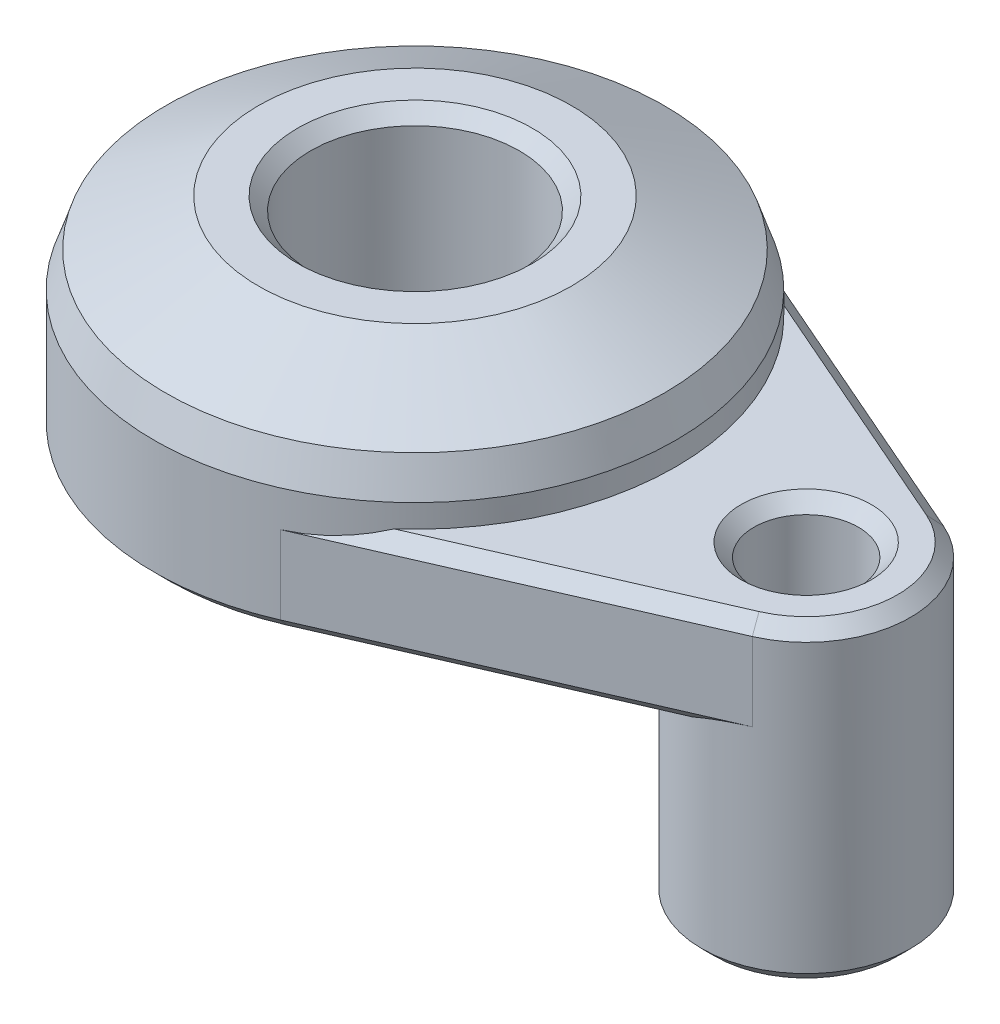
ISO-10303-21;
HEADER;
FILE_DESCRIPTION(('STEP AP214'),'2;1');
FILE_NAME('part.step','',(''),(''),'','','');
FILE_SCHEMA(('AUTOMOTIVE_DESIGN { 1 0 10303 214 1 1 1 1 }'));
ENDSEC;
DATA;
#1=APPLICATION_CONTEXT('core data for automotive mechanical design processes');
#2=APPLICATION_PROTOCOL_DEFINITION('international standard','automotive_design',2000,#1);
#3=PRODUCT_CONTEXT('',#1,'mechanical');
#4=PRODUCT('Part','Part','',(#3));
#5=PRODUCT_RELATED_PRODUCT_CATEGORY('part','',(#4));
#6=PRODUCT_DEFINITION_FORMATION('','',#4);
#7=PRODUCT_DEFINITION_CONTEXT('part definition',#1,'design');
#8=PRODUCT_DEFINITION('design','',#6,#7);
#9=PRODUCT_DEFINITION_SHAPE('','',#8);
#10=(LENGTH_UNIT() NAMED_UNIT(*) SI_UNIT(.MILLI.,.METRE.));
#11=(NAMED_UNIT(*) PLANE_ANGLE_UNIT() SI_UNIT($,.RADIAN.));
#12=(NAMED_UNIT(*) SI_UNIT($,.STERADIAN.) SOLID_ANGLE_UNIT());
#13=UNCERTAINTY_MEASURE_WITH_UNIT(LENGTH_MEASURE(1.E-05),#10,'distance_accuracy_value','');
#14=(GEOMETRIC_REPRESENTATION_CONTEXT(3) GLOBAL_UNCERTAINTY_ASSIGNED_CONTEXT((#13)) GLOBAL_UNIT_ASSIGNED_CONTEXT((#10,
#11,#12)) REPRESENTATION_CONTEXT('',''));
#15=CARTESIAN_POINT('',(0.,0.,0.));
#16=DIRECTION('',(0.,0.,1.));
#17=DIRECTION('',(1.,0.,0.));
#18=AXIS2_PLACEMENT_3D('',#15,#16,#17);
#19=CARTESIAN_POINT('',(0.,2.,0.));
#20=DIRECTION('',(0.,-1.,0.));
#21=DIRECTION('',(0.,0.,-1.));
#22=AXIS2_PLACEMENT_3D('',#19,#20,#21);
#23=CYLINDRICAL_SURFACE('',#22,5.);
#24=CARTESIAN_POINT('',(0.,2.44098300562487,0.));
#25=DIRECTION('',(0.,1.,0.));
#26=DIRECTION('',(-1.,0.,0.));
#27=AXIS2_PLACEMENT_3D('',#24,#25,#26);
#28=CIRCLE('',#27,5.);
#29=CARTESIAN_POINT('',(5.,2.44098300562489,0.));
#30=VERTEX_POINT('',#29);
#31=EDGE_CURVE('E125',#30,#30,#28,.F.);
#32=ORIENTED_EDGE('',*,*,#31,.T.);
#33=EDGE_LOOP('',(#32));
#34=FACE_BOUND('',#33,.T.);
#35=CARTESIAN_POINT('',(0.,2.,0.));
#36=DIRECTION('',(0.,-1.,0.));
#37=DIRECTION('',(1.,0.,0.));
#38=AXIS2_PLACEMENT_3D('',#35,#36,#37);
#39=CIRCLE('',#38,5.00000000000001);
#40=CARTESIAN_POINT('',(3.33090880212542,2.00000000000001,-3.72894711036821));
#41=VERTEX_POINT('',#40);
#42=CARTESIAN_POINT('',(3.33090880212543,2.00000000000001,3.7289471103682));
#43=VERTEX_POINT('',#42);
#44=EDGE_CURVE('E126',#41,#43,#39,.T.);
#45=ORIENTED_EDGE('',*,*,#44,.F.);
#46=CARTESIAN_POINT('',(0.,6.75000000000002,0.));
#47=DIRECTION('',(0.282842712474619,0.707106781186546,-0.648074069840787));
#48=DIRECTION('',(0.282842712474618,-0.707106781186549,-0.648074069840785));
#49=AXIS2_PLACEMENT_3D('',#46,#47,#48);
#50=ELLIPSE('',#49,7.07106781186549,5.);
#51=CARTESIAN_POINT('',(2.,1.75,-4.58257569495584));
#52=VERTEX_POINT('',#51);
#53=EDGE_CURVE('E57',#41,#52,#50,.T.);
#54=ORIENTED_EDGE('',*,*,#53,.T.);
#55=DIRECTION('',(0.,-1.,0.));
#56=VECTOR('',#55,1.);
#57=CARTESIAN_POINT('',(2.,2.,-4.58257569495584));
#58=LINE('',#57,#56);
#59=CARTESIAN_POINT('',(2.,0.250000000000002,-4.58257569495584));
#60=VERTEX_POINT('',#59);
#61=EDGE_CURVE('E119',#52,#60,#58,.T.);
#62=ORIENTED_EDGE('',*,*,#61,.T.);
#63=CARTESIAN_POINT('',(0.,0.250000000000002,0.));
#64=DIRECTION('',(0.,1.,0.));
#65=DIRECTION('',(0.,0.,1.));
#66=AXIS2_PLACEMENT_3D('',#63,#64,#65);
#67=CIRCLE('',#66,5.);
#68=CARTESIAN_POINT('',(2.,0.250000000000002,4.58257569495584));
#69=VERTEX_POINT('',#68);
#70=EDGE_CURVE('E118',#60,#69,#67,.T.);
#71=ORIENTED_EDGE('',*,*,#70,.T.);
#72=DIRECTION('',(0.,-1.,0.));
#73=VECTOR('',#72,1.);
#74=CARTESIAN_POINT('',(2.,2.,4.58257569495584));
#75=LINE('',#74,#73);
#76=CARTESIAN_POINT('',(2.,1.75,4.58257569495584));
#77=VERTEX_POINT('',#76);
#78=EDGE_CURVE('E107',#77,#69,#75,.T.);
#79=ORIENTED_EDGE('',*,*,#78,.F.);
#80=CARTESIAN_POINT('',(0.,6.75,0.));
#81=DIRECTION('',(0.282842712474619,0.707106781186547,0.648074069840786));
#82=DIRECTION('',(0.282842712474619,-0.707106781186548,0.648074069840786));
#83=AXIS2_PLACEMENT_3D('',#80,#81,#82);
#84=ELLIPSE('',#83,7.07106781186547,5.);
#85=EDGE_CURVE('E185',#77,#43,#84,.T.);
#86=ORIENTED_EDGE('',*,*,#85,.T.);
#87=EDGE_LOOP('',(#45,#54,#62,#71,#79,#86));
#88=FACE_BOUND('',#87,.T.);
#89=ADVANCED_FACE('F41',(#34,#88),#23,.T.);
#90=CARTESIAN_POINT('',(2.,2.,4.58257569495584));
#91=DIRECTION('',(-0.4,0.,-0.916515138991168));
#92=DIRECTION('',(-0.916515138991168,0.,0.4));
#93=AXIS2_PLACEMENT_3D('',#90,#91,#92);
#94=PLANE('',#93);
#95=DIRECTION('',(0.,-1.,0.));
#96=VECTOR('',#95,1.);
#97=CARTESIAN_POINT('',(8.3,2.,1.83303027798234));
#98=LINE('',#97,#96);
#99=CARTESIAN_POINT('',(8.3,1.75,1.83303027798234));
#100=VERTEX_POINT('',#99);
#101=CARTESIAN_POINT('',(8.3,0.250000000000002,1.83303027798234));
#102=VERTEX_POINT('',#101);
#103=EDGE_CURVE('E115',#100,#102,#98,.T.);
#104=ORIENTED_EDGE('',*,*,#103,.F.);
#105=DIRECTION('',(-0.916515138991168,0.,0.4));
#106=VECTOR('',#105,1.);
#107=CARTESIAN_POINT('',(2.,1.75,4.58257569495584));
#108=LINE('',#107,#106);
#109=EDGE_CURVE('E65',#100,#77,#108,.T.);
#110=ORIENTED_EDGE('',*,*,#109,.T.);
#111=ORIENTED_EDGE('',*,*,#78,.T.);
#112=DIRECTION('',(0.916515138991168,0.,-0.4));
#113=VECTOR('',#112,1.);
#114=CARTESIAN_POINT('',(2.,0.250000000000002,4.58257569495584));
#115=LINE('',#114,#113);
#116=EDGE_CURVE('E111',#69,#102,#115,.T.);
#117=ORIENTED_EDGE('',*,*,#116,.T.);
#118=EDGE_LOOP('',(#104,#110,#111,#117));
#119=FACE_BOUND('',#118,.T.);
#120=ADVANCED_FACE('F109',(#119),#94,.F.);
#121=CARTESIAN_POINT('',(7.5,2.,0.));
#122=DIRECTION('',(0.,-1.,0.));
#123=DIRECTION('',(0.,0.,-1.));
#124=AXIS2_PLACEMENT_3D('',#121,#122,#123);
#125=CYLINDRICAL_SURFACE('',#124,2.);
#126=CARTESIAN_POINT('',(7.5,-3.75,0.));
#127=DIRECTION('',(0.,1.,0.));
#128=DIRECTION('',(0.,0.,1.));
#129=AXIS2_PLACEMENT_3D('',#126,#127,#128);
#130=CIRCLE('',#129,2.);
#131=CARTESIAN_POINT('',(7.5,-3.75,2.));
#132=VERTEX_POINT('',#131);
#133=EDGE_CURVE('E163',#132,#132,#130,.T.);
#134=ORIENTED_EDGE('',*,*,#133,.T.);
#135=EDGE_LOOP('',(#134));
#136=FACE_BOUND('',#135,.T.);
#137=DIRECTION('',(0.,-1.,0.));
#138=VECTOR('',#137,1.);
#139=CARTESIAN_POINT('',(8.3,2.,-1.83303027798234));
#140=LINE('',#139,#138);
#141=CARTESIAN_POINT('',(8.3,1.75,-1.83303027798234));
#142=VERTEX_POINT('',#141);
#143=CARTESIAN_POINT('',(8.3,0.250000000000002,-1.83303027798234));
#144=VERTEX_POINT('',#143);
#145=EDGE_CURVE('E248',#142,#144,#140,.T.);
#146=ORIENTED_EDGE('',*,*,#145,.F.);
#147=CARTESIAN_POINT('',(7.5,1.75,0.));
#148=DIRECTION('',(0.,1.,0.));
#149=DIRECTION('',(0.,0.,1.));
#150=AXIS2_PLACEMENT_3D('',#147,#148,#149);
#151=CIRCLE('',#150,2.);
#152=EDGE_CURVE('E161',#142,#100,#151,.F.);
#153=ORIENTED_EDGE('',*,*,#152,.T.);
#154=ORIENTED_EDGE('',*,*,#103,.T.);
#155=CARTESIAN_POINT('',(7.5,-1.74999999999999,0.));
#156=DIRECTION('',(-0.282842712474619,0.707106781186548,-0.648074069840785));
#157=DIRECTION('',(-0.282842712474619,-0.707106781186547,-0.648074069840787));
#158=AXIS2_PLACEMENT_3D('',#155,#156,#157);
#159=ELLIPSE('',#158,2.82842712474619,2.);
#160=CARTESIAN_POINT('',(7.31258803253505,0.,1.99119982785529));
#161=VERTEX_POINT('',#160);
#162=EDGE_CURVE('E134',#102,#161,#159,.F.);
#163=ORIENTED_EDGE('',*,*,#162,.T.);
#164=CARTESIAN_POINT('',(7.5,0.,0.));
#165=DIRECTION('',(0.,1.,0.));
#166=DIRECTION('',(0.,0.,1.));
#167=AXIS2_PLACEMENT_3D('',#164,#165,#166);
#168=CIRCLE('',#167,2.);
#169=CARTESIAN_POINT('',(7.31258803253505,0.,-1.99119982785529));
#170=VERTEX_POINT('',#169);
#171=EDGE_CURVE('E114',#170,#161,#168,.T.);
#172=ORIENTED_EDGE('',*,*,#171,.F.);
#173=CARTESIAN_POINT('',(7.5,-1.75,0.));
#174=DIRECTION('',(-0.282842712474619,0.707106781186548,0.648074069840786));
#175=DIRECTION('',(-0.282842712474619,-0.707106781186547,0.648074069840787));
#176=AXIS2_PLACEMENT_3D('',#173,#174,#175);
#177=ELLIPSE('',#176,2.82842712474619,2.);
#178=EDGE_CURVE('E135',#170,#144,#177,.F.);
#179=ORIENTED_EDGE('',*,*,#178,.T.);
#180=EDGE_LOOP('',(#146,#153,#154,#163,#172,#179));
#181=FACE_BOUND('',#180,.T.);
#182=ADVANCED_FACE('F266',(#136,#181),#125,.T.);
#183=CARTESIAN_POINT('',(8.3,2.,-1.83303027798234));
#184=DIRECTION('',(-0.4,0.,0.916515138991168));
#185=DIRECTION('',(0.916515138991168,0.,0.4));
#186=AXIS2_PLACEMENT_3D('',#183,#184,#185);
#187=PLANE('',#186);
#188=ORIENTED_EDGE('',*,*,#61,.F.);
#189=DIRECTION('',(0.916515138991168,0.,0.4));
#190=VECTOR('',#189,1.);
#191=CARTESIAN_POINT('',(8.3,1.75,-1.83303027798234));
#192=LINE('',#191,#190);
#193=EDGE_CURVE('E177',#52,#142,#192,.T.);
#194=ORIENTED_EDGE('',*,*,#193,.T.);
#195=ORIENTED_EDGE('',*,*,#145,.T.);
#196=DIRECTION('',(-0.916515138991168,0.,-0.4));
#197=VECTOR('',#196,1.);
#198=CARTESIAN_POINT('',(8.3,0.250000000000002,-1.83303027798234));
#199=LINE('',#198,#197);
#200=EDGE_CURVE('E256',#144,#60,#199,.T.);
#201=ORIENTED_EDGE('',*,*,#200,.T.);
#202=EDGE_LOOP('',(#188,#194,#195,#201));
#203=FACE_BOUND('',#202,.T.);
#204=ADVANCED_FACE('F289',(#203),#187,.F.);
#205=CARTESIAN_POINT('',(0.,2.,0.));
#206=DIRECTION('',(0.,1.,0.));
#207=DIRECTION('',(0.,0.,1.));
#208=AXIS2_PLACEMENT_3D('',#205,#206,#207);
#209=PLANE('',#208);
#210=CARTESIAN_POINT('',(7.5,2.,0.));
#211=DIRECTION('',(0.,1.,0.));
#212=DIRECTION('',(0.,0.,1.));
#213=AXIS2_PLACEMENT_3D('',#210,#211,#212);
#214=CIRCLE('',#213,1.25000000000001);
#215=CARTESIAN_POINT('',(7.5,2.,1.25000000000001));
#216=VERTEX_POINT('',#215);
#217=EDGE_CURVE('E173',#216,#216,#214,.F.);
#218=ORIENTED_EDGE('',*,*,#217,.T.);
#219=EDGE_LOOP('',(#218));
#220=FACE_BOUND('',#219,.T.);
#221=ORIENTED_EDGE('',*,*,#44,.T.);
#222=DIRECTION('',(0.916515138991168,0.,-0.4));
#223=VECTOR('',#222,1.);
#224=CARTESIAN_POINT('',(8.2,2.,1.60390149323454));
#225=LINE('',#224,#223);
#226=CARTESIAN_POINT('',(8.2,2.,1.60390149323454));
#227=VERTEX_POINT('',#226);
#228=EDGE_CURVE('E170',#43,#227,#225,.T.);
#229=ORIENTED_EDGE('',*,*,#228,.T.);
#230=CARTESIAN_POINT('',(7.5,2.,0.));
#231=DIRECTION('',(0.,1.,0.));
#232=DIRECTION('',(0.,0.,1.));
#233=AXIS2_PLACEMENT_3D('',#230,#231,#232);
#234=CIRCLE('',#233,1.75);
#235=CARTESIAN_POINT('',(8.2,2.,-1.60390149323455));
#236=VERTEX_POINT('',#235);
#237=EDGE_CURVE('E166',#227,#236,#234,.T.);
#238=ORIENTED_EDGE('',*,*,#237,.T.);
#239=DIRECTION('',(-0.916515138991168,0.,-0.4));
#240=VECTOR('',#239,1.);
#241=CARTESIAN_POINT('',(1.89999999999999,2.,-4.35344691020805));
#242=LINE('',#241,#240);
#243=EDGE_CURVE('E168',#236,#41,#242,.T.);
#244=ORIENTED_EDGE('',*,*,#243,.T.);
#245=EDGE_LOOP('',(#221,#229,#238,#244));
#246=FACE_BOUND('',#245,.T.);
#247=ADVANCED_FACE('F287',(#220,#246),#209,.T.);
#248=CARTESIAN_POINT('',(0.,0.,0.));
#249=DIRECTION('',(0.,1.,0.));
#250=DIRECTION('',(0.,0.,1.));
#251=AXIS2_PLACEMENT_3D('',#248,#249,#250);
#252=PLANE('',#251);
#253=CARTESIAN_POINT('',(0.,0.,0.));
#254=DIRECTION('',(0.,1.,0.));
#255=DIRECTION('',(0.,0.,1.));
#256=AXIS2_PLACEMENT_3D('',#253,#254,#255);
#257=CIRCLE('',#256,3.);
#258=CARTESIAN_POINT('',(0.,0.,3.));
#259=VERTEX_POINT('',#258);
#260=EDGE_CURVE('E145',#259,#259,#257,.T.);
#261=ORIENTED_EDGE('',*,*,#260,.T.);
#262=EDGE_LOOP('',(#261));
#263=FACE_BOUND('',#262,.T.);
#264=CARTESIAN_POINT('',(0.,0.,0.));
#265=DIRECTION('',(0.,1.,0.));
#266=DIRECTION('',(0.,0.,1.));
#267=AXIS2_PLACEMENT_3D('',#264,#265,#266);
#268=CIRCLE('',#267,4.75);
#269=CARTESIAN_POINT('',(1.9,0.,4.35344691020804));
#270=VERTEX_POINT('',#269);
#271=CARTESIAN_POINT('',(1.9,0.,-4.35344691020805));
#272=VERTEX_POINT('',#271);
#273=EDGE_CURVE('E139',#270,#272,#268,.F.);
#274=ORIENTED_EDGE('',*,*,#273,.T.);
#275=DIRECTION('',(0.916515138991168,0.,0.4));
#276=VECTOR('',#275,1.);
#277=CARTESIAN_POINT('',(1.9,0.,-4.35344691020805));
#278=LINE('',#277,#276);
#279=EDGE_CURVE('E136',#272,#170,#278,.T.);
#280=ORIENTED_EDGE('',*,*,#279,.T.);
#281=ORIENTED_EDGE('',*,*,#171,.T.);
#282=DIRECTION('',(-0.916515138991168,0.,0.4));
#283=VECTOR('',#282,1.);
#284=CARTESIAN_POINT('',(1.9,0.,4.35344691020804));
#285=LINE('',#284,#283);
#286=EDGE_CURVE('E259',#161,#270,#285,.T.);
#287=ORIENTED_EDGE('',*,*,#286,.T.);
#288=EDGE_LOOP('',(#274,#280,#281,#287));
#289=FACE_BOUND('',#288,.T.);
#290=ADVANCED_FACE('F269',(#263,#289),#252,.F.);
#291=CARTESIAN_POINT('',(7.5,-4.,0.));
#292=DIRECTION('',(0.,1.,0.));
#293=DIRECTION('',(0.,0.,1.));
#294=AXIS2_PLACEMENT_3D('',#291,#292,#293);
#295=PLANE('',#294);
#296=CARTESIAN_POINT('',(7.5,-4.,0.));
#297=DIRECTION('',(0.,1.,0.));
#298=DIRECTION('',(0.,0.,1.));
#299=AXIS2_PLACEMENT_3D('',#296,#297,#298);
#300=CIRCLE('',#299,1.25000000000001);
#301=CARTESIAN_POINT('',(7.5,-4.,1.25000000000001));
#302=VERTEX_POINT('',#301);
#303=EDGE_CURVE('E158',#302,#302,#300,.T.);
#304=ORIENTED_EDGE('',*,*,#303,.T.);
#305=EDGE_LOOP('',(#304));
#306=FACE_BOUND('',#305,.T.);
#307=CARTESIAN_POINT('',(7.5,-4.,0.));
#308=DIRECTION('',(0.,1.,0.));
#309=DIRECTION('',(0.,0.,1.));
#310=AXIS2_PLACEMENT_3D('',#307,#308,#309);
#311=CIRCLE('',#310,1.75);
#312=CARTESIAN_POINT('',(7.5,-4.,1.75));
#313=VERTEX_POINT('',#312);
#314=EDGE_CURVE('E155',#313,#313,#311,.F.);
#315=ORIENTED_EDGE('',*,*,#314,.T.);
#316=EDGE_LOOP('',(#315));
#317=FACE_BOUND('',#316,.T.);
#318=ADVANCED_FACE('F297',(#306,#317),#295,.F.);
#319=CARTESIAN_POINT('',(7.5,-8.24264068711929,0.));
#320=DIRECTION('',(0.,1.,0.));
#321=DIRECTION('',(0.,0.,1.));
#322=AXIS2_PLACEMENT_3D('',#319,#320,#321);
#323=CYLINDRICAL_SURFACE('',#322,1.);
#324=CARTESIAN_POINT('',(7.5,-3.74999999999999,0.));
#325=DIRECTION('',(0.,1.,0.));
#326=DIRECTION('',(0.,0.,1.));
#327=AXIS2_PLACEMENT_3D('',#324,#325,#326);
#328=CIRCLE('',#327,1.);
#329=CARTESIAN_POINT('',(7.5,-3.74999999999999,1.));
#330=VERTEX_POINT('',#329);
#331=EDGE_CURVE('E152',#330,#330,#328,.F.);
#332=CARTESIAN_POINT('',(7.5,1.74999999999999,0.));
#333=DIRECTION('',(0.,1.,0.));
#334=DIRECTION('',(0.,0.,1.));
#335=AXIS2_PLACEMENT_3D('',#332,#333,#334);
#336=CIRCLE('',#335,1.);
#337=CARTESIAN_POINT('',(7.5,1.74999999999999,1.));
#338=VERTEX_POINT('',#337);
#339=EDGE_CURVE('E149',#338,#338,#336,.T.);
#340=CARTESIAN_POINT('',(7.5,-3.74999999999999,1.));
#341=CARTESIAN_POINT('',(7.5,-3.69270833333333,1.));
#342=CARTESIAN_POINT('',(7.5,-3.63541666666666,1.));
#343=CARTESIAN_POINT('',(7.5,-3.52083333333333,1.));
#344=CARTESIAN_POINT('',(7.5,-3.46354166666666,1.));
#345=CARTESIAN_POINT('',(7.5,-3.34895833333333,1.));
#346=CARTESIAN_POINT('',(7.5,-3.29166666666666,1.));
#347=CARTESIAN_POINT('',(7.5,-3.17708333333333,1.));
#348=CARTESIAN_POINT('',(7.5,-3.11979166666666,1.));
#349=CARTESIAN_POINT('',(7.5,-3.00520833333333,1.));
#350=CARTESIAN_POINT('',(7.5,-2.94791666666666,1.));
#351=CARTESIAN_POINT('',(7.5,-2.83333333333333,1.));
#352=CARTESIAN_POINT('',(7.5,-2.77604166666666,1.));
#353=CARTESIAN_POINT('',(7.5,-2.66145833333333,1.));
#354=CARTESIAN_POINT('',(7.5,-2.60416666666666,1.));
#355=CARTESIAN_POINT('',(7.5,-2.48958333333333,1.));
#356=CARTESIAN_POINT('',(7.5,-2.43229166666666,1.));
#357=CARTESIAN_POINT('',(7.5,-2.31770833333333,1.));
#358=CARTESIAN_POINT('',(7.5,-2.26041666666666,1.));
#359=CARTESIAN_POINT('',(7.5,-2.14583333333333,1.));
#360=CARTESIAN_POINT('',(7.5,-2.08854166666667,1.));
#361=CARTESIAN_POINT('',(7.5,-1.97395833333333,1.));
#362=CARTESIAN_POINT('',(7.5,-1.91666666666667,1.));
#363=CARTESIAN_POINT('',(7.5,-1.80208333333333,1.));
#364=CARTESIAN_POINT('',(7.5,-1.74479166666667,1.));
#365=CARTESIAN_POINT('',(7.5,-1.63020833333333,1.));
#366=CARTESIAN_POINT('',(7.5,-1.57291666666667,1.));
#367=CARTESIAN_POINT('',(7.5,-1.45833333333333,1.));
#368=CARTESIAN_POINT('',(7.5,-1.40104166666667,1.));
#369=CARTESIAN_POINT('',(7.5,-1.28645833333334,1.));
#370=CARTESIAN_POINT('',(7.5,-1.22916666666667,1.));
#371=CARTESIAN_POINT('',(7.5,-1.11458333333334,1.));
#372=CARTESIAN_POINT('',(7.5,-1.05729166666667,1.));
#373=CARTESIAN_POINT('',(7.5,-0.942708333333336,1.));
#374=CARTESIAN_POINT('',(7.5,-0.88541666666667,1.));
#375=CARTESIAN_POINT('',(7.5,-0.770833333333337,1.));
#376=CARTESIAN_POINT('',(7.5,-0.71354166666667,1.));
#377=CARTESIAN_POINT('',(7.5,-0.598958333333337,1.));
#378=CARTESIAN_POINT('',(7.5,-0.541666666666671,1.));
#379=CARTESIAN_POINT('',(7.5,-0.427083333333338,1.));
#380=CARTESIAN_POINT('',(7.5,-0.369791666666672,1.));
#381=CARTESIAN_POINT('',(7.5,-0.255208333333339,1.));
#382=CARTESIAN_POINT('',(7.5,-0.197916666666672,1.));
#383=CARTESIAN_POINT('',(7.5,-0.0833333333333392,1.));
#384=CARTESIAN_POINT('',(7.5,-0.026041666666673,1.));
#385=CARTESIAN_POINT('',(7.5,0.0885416666666592,1.));
#386=CARTESIAN_POINT('',(7.5,0.145833333333325,1.));
#387=CARTESIAN_POINT('',(7.5,0.260416666666658,1.));
#388=CARTESIAN_POINT('',(7.5,0.317708333333325,1.));
#389=CARTESIAN_POINT('',(7.5,0.432291666666658,1.));
#390=CARTESIAN_POINT('',(7.5,0.489583333333325,1.));
#391=CARTESIAN_POINT('',(7.5,0.604166666666658,1.));
#392=CARTESIAN_POINT('',(7.5,0.661458333333324,1.));
#393=CARTESIAN_POINT('',(7.5,0.776041666666657,1.));
#394=CARTESIAN_POINT('',(7.5,0.833333333333324,1.));
#395=CARTESIAN_POINT('',(7.5,0.947916666666657,1.));
#396=CARTESIAN_POINT('',(7.5,1.00520833333332,1.));
#397=CARTESIAN_POINT('',(7.5,1.11979166666666,1.));
#398=CARTESIAN_POINT('',(7.5,1.17708333333332,1.));
#399=CARTESIAN_POINT('',(7.5,1.29166666666666,1.));
#400=CARTESIAN_POINT('',(7.5,1.34895833333332,1.));
#401=CARTESIAN_POINT('',(7.5,1.46354166666666,1.));
#402=CARTESIAN_POINT('',(7.5,1.52083333333332,1.));
#403=CARTESIAN_POINT('',(7.5,1.63541666666666,1.));
#404=CARTESIAN_POINT('',(7.5,1.69270833333332,1.));
#405=CARTESIAN_POINT('',(7.5,1.74999999999999,1.));
#406=B_SPLINE_CURVE_WITH_KNOTS('',3,(#340,#341,#342,#343,#344,#345,#346,#347,#348,#349,#350,
#351,#352,#353,#354,#355,#356,#357,#358,#359,#360,#361,#362,#363,#364,#365,#366,#367,#368,#369,
#370,#371,#372,#373,#374,#375,#376,#377,#378,#379,#380,#381,#382,#383,#384,#385,#386,#387,#388,
#389,#390,#391,#392,#393,#394,#395,#396,#397,#398,#399,#400,#401,#402,#403,#404,#405),
.UNSPECIFIED.,.F.,.F.,(4,2,2,2,2,2,2,2,2,2,2,2,2,2,2,2,2,2,2,2,2,2,2,2,2,2,2,2,2,2,2,2,4),(0.,
0.171874999999999,0.343749999999999,0.515624999999999,0.687499999999998,0.859374999999997,
1.03125,1.203125,1.375,1.546875,1.71874999999999,1.89062499999999,2.06249999999999,
2.23437499999999,2.40624999999999,2.57812499999999,2.74999999999999,2.92187499999999,
3.09374999999999,3.26562499999999,3.43749999999999,3.60937499999999,3.78124999999999,
3.95312499999999,4.12499999999999,4.29687499999999,4.46874999999998,4.64062499999998,
4.81249999999998,4.98437499999998,5.15624999999998,5.32812499999998,5.49999999999998),.UNSPECIFIED.);
#407=EDGE_CURVE('BSEAM397',#330,#338,#406,.T.);
#408=ORIENTED_EDGE('',*,*,#331,.T.);
#409=ORIENTED_EDGE('',*,*,#339,.T.);
#410=ORIENTED_EDGE('',*,*,#407,.T.);
#411=ORIENTED_EDGE('',*,*,#407,.F.);
#412=EDGE_LOOP('',(#408,#410,#409,#411));
#413=FACE_BOUND('',#412,.T.);
#414=ADVANCED_FACE('F397',(#413),#323,.F.);
#415=CARTESIAN_POINT('',(3.,4.00000000000001,0.));
#416=DIRECTION('',(0.,1.,0.));
#417=DIRECTION('',(-1.,0.,0.));
#418=AXIS2_PLACEMENT_3D('',#415,#416,#417);
#419=PLANE('',#418);
#420=CARTESIAN_POINT('',(0.,3.99999999999999,0.));
#421=DIRECTION('',(0.,1.,0.));
#422=DIRECTION('',(-1.,0.,0.));
#423=AXIS2_PLACEMENT_3D('',#420,#421,#422);
#424=CIRCLE('',#423,2.25);
#425=CARTESIAN_POINT('',(-2.25,3.99999999999999,0.));
#426=VERTEX_POINT('',#425);
#427=EDGE_CURVE('E50',#426,#426,#424,.F.);
#428=ORIENTED_EDGE('',*,*,#427,.T.);
#429=EDGE_LOOP('',(#428));
#430=FACE_BOUND('',#429,.T.);
#431=CARTESIAN_POINT('',(0.,4.,0.));
#432=DIRECTION('',(0.,-1.,0.));
#433=DIRECTION('',(1.,0.,0.));
#434=AXIS2_PLACEMENT_3D('',#431,#432,#433);
#435=CIRCLE('',#434,3.00000000000001);
#436=CARTESIAN_POINT('',(3.,4.00000000000001,0.));
#437=VERTEX_POINT('',#436);
#438=EDGE_CURVE('E140',#437,#437,#435,.T.);
#439=ORIENTED_EDGE('',*,*,#438,.F.);
#440=EDGE_LOOP('',(#439));
#441=FACE_BOUND('',#440,.T.);
#442=ADVANCED_FACE('F201',(#430,#441),#419,.T.);
#443=CARTESIAN_POINT('',(0.,2.99999999999989,0.));
#444=DIRECTION('',(0.,-1.,0.));
#445=DIRECTION('',(1.,0.,0.));
#446=AXIS2_PLACEMENT_3D('',#443,#444,#445);
#447=CONICAL_SURFACE('',#446,5.00000000000001,1.10714871779405);
#448=CARTESIAN_POINT('',(0.,3.11180339887489,0.));
#449=DIRECTION('',(0.,-1.,0.));
#450=DIRECTION('',(1.,0.,0.));
#451=AXIS2_PLACEMENT_3D('',#448,#449,#450);
#452=CIRCLE('',#451,4.77639320225003);
#453=CARTESIAN_POINT('',(4.77639320225002,3.11180339887491,0.));
#454=VERTEX_POINT('',#453);
#455=EDGE_CURVE('E253',#454,#454,#452,.F.);
#456=ORIENTED_EDGE('',*,*,#455,.T.);
#457=EDGE_LOOP('',(#456));
#458=FACE_BOUND('',#457,.T.);
#459=ORIENTED_EDGE('',*,*,#438,.T.);
#460=EDGE_LOOP('',(#459));
#461=FACE_BOUND('',#460,.T.);
#462=ADVANCED_FACE('F317',(#458,#461),#447,.T.);
#463=CARTESIAN_POINT('',(0.,2.4409830056249,0.));
#464=DIRECTION('',(0.,-1.,0.));
#465=DIRECTION('',(1.,0.,0.));
#466=AXIS2_PLACEMENT_3D('',#463,#464,#465);
#467=CONICAL_SURFACE('',#466,5.,0.321750554396599);
#468=CARTESIAN_POINT('',(4.77639320225002,3.11180339887491,0.));
#469=CARTESIAN_POINT('',(4.77872243972658,3.10481568644522,0.));
#470=CARTESIAN_POINT('',(4.78105167720315,3.09782797401553,0.));
#471=CARTESIAN_POINT('',(4.78571015215627,3.08385254915616,0.));
#472=CARTESIAN_POINT('',(4.78803938963283,3.07686483672647,0.));
#473=CARTESIAN_POINT('',(4.79269786458596,3.0628894118671,0.));
#474=CARTESIAN_POINT('',(4.79502710206252,3.05590169943741,0.));
#475=CARTESIAN_POINT('',(4.79968557701565,3.04192627457803,0.));
#476=CARTESIAN_POINT('',(4.80201481449221,3.03493856214834,0.));
#477=CARTESIAN_POINT('',(4.80667328944533,3.02096313728897,0.));
#478=CARTESIAN_POINT('',(4.80900252692189,3.01397542485928,0.));
#479=CARTESIAN_POINT('',(4.81366100187502,2.99999999999991,0.));
#480=CARTESIAN_POINT('',(4.81599023935158,2.99301228757022,0.));
#481=CARTESIAN_POINT('',(4.82064871430471,2.97903686271084,0.));
#482=CARTESIAN_POINT('',(4.82297795178127,2.97204915028115,0.));
#483=CARTESIAN_POINT('',(4.82763642673439,2.95807372542178,0.));
#484=CARTESIAN_POINT('',(4.82996566421095,2.95108601299209,0.));
#485=CARTESIAN_POINT('',(4.83462413916408,2.93711058813272,0.));
#486=CARTESIAN_POINT('',(4.83695337664064,2.93012287570303,0.));
#487=CARTESIAN_POINT('',(4.84161185159376,2.91614745084365,0.));
#488=CARTESIAN_POINT('',(4.84394108907033,2.90915973841396,0.));
#489=CARTESIAN_POINT('',(4.84859956402345,2.89518431355459,0.));
#490=CARTESIAN_POINT('',(4.85092880150001,2.8881966011249,0.));
#491=CARTESIAN_POINT('',(4.85558727645314,2.87422117626553,0.));
#492=CARTESIAN_POINT('',(4.8579165139297,2.86723346383584,0.));
#493=CARTESIAN_POINT('',(4.86257498888283,2.85325803897646,0.));
#494=CARTESIAN_POINT('',(4.86490422635939,2.84627032654678,0.));
#495=CARTESIAN_POINT('',(4.86956270131251,2.8322949016874,0.));
#496=CARTESIAN_POINT('',(4.87189193878907,2.82530718925771,0.));
#497=CARTESIAN_POINT('',(4.8765504137422,2.81133176439834,0.));
#498=CARTESIAN_POINT('',(4.87887965121876,2.80434405196865,0.));
#499=CARTESIAN_POINT('',(4.88353812617189,2.79036862710927,0.));
#500=CARTESIAN_POINT('',(4.88586736364845,2.78338091467959,0.));
#501=CARTESIAN_POINT('',(4.89052583860157,2.76940548982021,0.));
#502=CARTESIAN_POINT('',(4.89285507607813,2.76241777739052,0.));
#503=CARTESIAN_POINT('',(4.89751355103126,2.74844235253115,0.));
#504=CARTESIAN_POINT('',(4.89984278850782,2.74145464010146,0.));
#505=CARTESIAN_POINT('',(4.90450126346095,2.72747921524208,0.));
#506=CARTESIAN_POINT('',(4.90683050093751,2.7204915028124,0.));
#507=CARTESIAN_POINT('',(4.91148897589063,2.70651607795302,0.));
#508=CARTESIAN_POINT('',(4.9138182133672,2.69952836552333,0.));
#509=CARTESIAN_POINT('',(4.91847668832032,2.68555294066396,0.));
#510=CARTESIAN_POINT('',(4.92080592579688,2.67856522823427,0.));
#511=CARTESIAN_POINT('',(4.92546440075001,2.66458980337489,0.));
#512=CARTESIAN_POINT('',(4.92779363822657,2.65760209094521,0.));
#513=CARTESIAN_POINT('',(4.93245211317969,2.64362666608583,0.));
#514=CARTESIAN_POINT('',(4.93478135065626,2.63663895365614,0.));
#515=CARTESIAN_POINT('',(4.93943982560938,2.62266352879677,0.));
#516=CARTESIAN_POINT('',(4.94176906308594,2.61567581636708,0.));
#517=CARTESIAN_POINT('',(4.94642753803907,2.60170039150771,0.));
#518=CARTESIAN_POINT('',(4.94875677551563,2.59471267907802,0.));
#519=CARTESIAN_POINT('',(4.95341525046875,2.58073725421864,0.));
#520=CARTESIAN_POINT('',(4.95574448794532,2.57374954178895,0.));
#521=CARTESIAN_POINT('',(4.96040296289844,2.55977411692958,0.));
#522=CARTESIAN_POINT('',(4.962732200375,2.55278640449989,0.));
#523=CARTESIAN_POINT('',(4.96739067532813,2.53881097964052,0.));
#524=CARTESIAN_POINT('',(4.96971991280469,2.53182326721083,0.));
#525=CARTESIAN_POINT('',(4.97437838775781,2.51784784235145,0.));
#526=CARTESIAN_POINT('',(4.97670762523438,2.51086012992176,0.));
#527=CARTESIAN_POINT('',(4.9813661001875,2.49688470506239,0.));
#528=CARTESIAN_POINT('',(4.98369533766406,2.4898969926327,0.));
#529=CARTESIAN_POINT('',(4.98835381261719,2.47592156777333,0.));
#530=CARTESIAN_POINT('',(4.99068305009375,2.46893385534364,0.));
#531=CARTESIAN_POINT('',(4.99534152504688,2.45495843048426,0.));
#532=CARTESIAN_POINT('',(4.99767076252344,2.44797071805458,0.));
#533=CARTESIAN_POINT('',(5.,2.44098300562489,0.));
#534=B_SPLINE_CURVE_WITH_KNOTS('',3,(#468,#469,#470,#471,#472,#473,#474,#475,#476,#477,#478,
#479,#480,#481,#482,#483,#484,#485,#486,#487,#488,#489,#490,#491,#492,#493,#494,#495,#496,#497,
#498,#499,#500,#501,#502,#503,#504,#505,#506,#507,#508,#509,#510,#511,#512,#513,#514,#515,#516,
#517,#518,#519,#520,#521,#522,#523,#524,#525,#526,#527,#528,#529,#530,#531,#532,#533),
.UNSPECIFIED.,.F.,.F.,(4,2,2,2,2,2,2,2,2,2,2,2,2,2,2,2,2,2,2,2,2,2,2,2,2,2,2,2,2,2,2,2,4),(0.,
0.0220970869120819,0.0441941738241643,0.0662912607362462,0.0883883476483288,0.110485434560411,
0.132582521472493,0.154679608384575,0.176776695296657,0.198873782208739,0.220970869120821,
0.243067956032903,0.265165042944985,0.287262129857067,0.309359216769149,0.331456303681231,
0.353553390593314,0.375650477505395,0.397747564417478,0.419844651329559,0.441941738241642,
0.464038825153724,0.486135912065806,0.508232998977888,0.53033008588997,0.552427172802052,
0.574524259714134,0.596621346626216,0.618718433538299,0.640815520450381,0.662912607362463,
0.685009694274545,0.707106781186626),.UNSPECIFIED.);
#535=EDGE_CURVE('BSEAM311',#454,#30,#534,.T.);
#536=ORIENTED_EDGE('',*,*,#455,.F.);
#537=ORIENTED_EDGE('',*,*,#31,.F.);
#538=ORIENTED_EDGE('',*,*,#535,.T.);
#539=ORIENTED_EDGE('',*,*,#535,.F.);
#540=EDGE_LOOP('',(#536,#538,#537,#539));
#541=FACE_BOUND('',#540,.T.);
#542=ADVANCED_FACE('F311',(#541),#467,.T.);
#543=CARTESIAN_POINT('',(2.,0.250000000000002,4.58257569495584));
#544=DIRECTION('',(-0.282842712474619,0.707106781186548,-0.648074069840785));
#545=DIRECTION('',(0.916515138991168,0.,-0.4));
#546=AXIS2_PLACEMENT_3D('',#543,#544,#545);
#547=PLANE('',#546);
#548=ORIENTED_EDGE('',*,*,#162,.F.);
#549=ORIENTED_EDGE('',*,*,#116,.F.);
#550=DIRECTION('',(0.282842712474619,0.707106781186547,0.648074069840786));
#551=VECTOR('',#550,1.);
#552=CARTESIAN_POINT('',(1.9,0.,4.35344691020804));
#553=LINE('',#552,#551);
#554=EDGE_CURVE('E132',#270,#69,#553,.T.);
#555=ORIENTED_EDGE('',*,*,#554,.F.);
#556=ORIENTED_EDGE('',*,*,#286,.F.);
#557=EDGE_LOOP('',(#548,#549,#555,#556));
#558=FACE_BOUND('',#557,.T.);
#559=ADVANCED_FACE('F130',(#558),#547,.F.);
#560=CARTESIAN_POINT('',(0.,0.250000000000002,0.));
#561=DIRECTION('',(0.,1.,0.));
#562=DIRECTION('',(0.,0.,1.));
#563=AXIS2_PLACEMENT_3D('',#560,#561,#562);
#564=CONICAL_SURFACE('',#563,5.,0.785398163397448);
#565=ORIENTED_EDGE('',*,*,#554,.T.);
#566=ORIENTED_EDGE('',*,*,#70,.F.);
#567=DIRECTION('',(0.282842712474619,0.707106781186547,-0.648074069840786));
#568=VECTOR('',#567,1.);
#569=CARTESIAN_POINT('',(1.9,0.,-4.35344691020805));
#570=LINE('',#569,#568);
#571=EDGE_CURVE('E141',#272,#60,#570,.T.);
#572=ORIENTED_EDGE('',*,*,#571,.F.);
#573=ORIENTED_EDGE('',*,*,#273,.F.);
#574=EDGE_LOOP('',(#565,#566,#572,#573));
#575=FACE_BOUND('',#574,.T.);
#576=ADVANCED_FACE('F138',(#575),#564,.T.);
#577=CARTESIAN_POINT('',(8.3,0.250000000000002,-1.83303027798234));
#578=DIRECTION('',(-0.282842712474619,0.707106781186548,0.648074069840786));
#579=DIRECTION('',(-0.916515138991168,0.,-0.4));
#580=AXIS2_PLACEMENT_3D('',#577,#578,#579);
#581=PLANE('',#580);
#582=ORIENTED_EDGE('',*,*,#178,.F.);
#583=ORIENTED_EDGE('',*,*,#279,.F.);
#584=ORIENTED_EDGE('',*,*,#571,.T.);
#585=ORIENTED_EDGE('',*,*,#200,.F.);
#586=EDGE_LOOP('',(#582,#583,#584,#585));
#587=FACE_BOUND('',#586,.T.);
#588=ADVANCED_FACE('F236',(#587),#581,.F.);
#589=CARTESIAN_POINT('',(0.,-1.5,0.));
#590=DIRECTION('',(0.,1.,0.));
#591=DIRECTION('',(0.,0.,1.));
#592=AXIS2_PLACEMENT_3D('',#589,#590,#591);
#593=CYLINDRICAL_SURFACE('',#592,3.);
#594=CARTESIAN_POINT('',(0.,-1.25,0.));
#595=DIRECTION('',(0.,1.,0.));
#596=DIRECTION('',(0.,0.,1.));
#597=AXIS2_PLACEMENT_3D('',#594,#595,#596);
#598=CIRCLE('',#597,3.);
#599=CARTESIAN_POINT('',(0.,-1.25,3.));
#600=VERTEX_POINT('',#599);
#601=EDGE_CURVE('E179',#600,#600,#598,.T.);
#602=ORIENTED_EDGE('',*,*,#601,.T.);
#603=EDGE_LOOP('',(#602));
#604=FACE_BOUND('',#603,.T.);
#605=ORIENTED_EDGE('',*,*,#260,.F.);
#606=EDGE_LOOP('',(#605));
#607=FACE_BOUND('',#606,.T.);
#608=ADVANCED_FACE('F224',(#604,#607),#593,.T.);
#609=CARTESIAN_POINT('',(0.,-1.5,0.));
#610=DIRECTION('',(0.,1.,0.));
#611=DIRECTION('',(0.,0.,1.));
#612=AXIS2_PLACEMENT_3D('',#609,#610,#611);
#613=PLANE('',#612);
#614=CARTESIAN_POINT('',(0.,-1.5,0.));
#615=DIRECTION('',(0.,1.,0.));
#616=DIRECTION('',(0.,0.,1.));
#617=AXIS2_PLACEMENT_3D('',#614,#615,#616);
#618=CIRCLE('',#617,2.24999999999999);
#619=CARTESIAN_POINT('',(0.,-1.5,2.24999999999999));
#620=VERTEX_POINT('',#619);
#621=EDGE_CURVE('E11',#620,#620,#618,.T.);
#622=ORIENTED_EDGE('',*,*,#621,.T.);
#623=EDGE_LOOP('',(#622));
#624=FACE_BOUND('',#623,.T.);
#625=CARTESIAN_POINT('',(0.,-1.5,0.));
#626=DIRECTION('',(0.,1.,0.));
#627=DIRECTION('',(0.,0.,1.));
#628=AXIS2_PLACEMENT_3D('',#625,#626,#627);
#629=CIRCLE('',#628,2.75);
#630=CARTESIAN_POINT('',(0.,-1.5,2.75));
#631=VERTEX_POINT('',#630);
#632=EDGE_CURVE('E182',#631,#631,#629,.F.);
#633=ORIENTED_EDGE('',*,*,#632,.T.);
#634=EDGE_LOOP('',(#633));
#635=FACE_BOUND('',#634,.T.);
#636=ADVANCED_FACE('F220',(#624,#635),#613,.F.);
#637=CARTESIAN_POINT('',(7.5,-3.74999999999999,0.));
#638=DIRECTION('',(0.,-1.,0.));
#639=DIRECTION('',(0.,0.,-1.));
#640=AXIS2_PLACEMENT_3D('',#637,#638,#639);
#641=CONICAL_SURFACE('',#640,1.,0.785398163397445);
#642=ORIENTED_EDGE('',*,*,#303,.F.);
#643=EDGE_LOOP('',(#642));
#644=FACE_BOUND('',#643,.T.);
#645=ORIENTED_EDGE('',*,*,#331,.F.);
#646=EDGE_LOOP('',(#645));
#647=FACE_BOUND('',#646,.T.);
#648=ADVANCED_FACE('F223',(#644,#647),#641,.F.);
#649=CARTESIAN_POINT('',(7.5,-3.75,0.));
#650=DIRECTION('',(0.,1.,0.));
#651=DIRECTION('',(0.,0.,1.));
#652=AXIS2_PLACEMENT_3D('',#649,#650,#651);
#653=CONICAL_SURFACE('',#652,2.,0.785398163397445);
#654=ORIENTED_EDGE('',*,*,#314,.F.);
#655=EDGE_LOOP('',(#654));
#656=FACE_BOUND('',#655,.T.);
#657=ORIENTED_EDGE('',*,*,#133,.F.);
#658=EDGE_LOOP('',(#657));
#659=FACE_BOUND('',#658,.T.);
#660=ADVANCED_FACE('F339',(#656,#659),#653,.T.);
#661=CARTESIAN_POINT('',(7.5,1.74999999999999,0.));
#662=DIRECTION('',(0.,1.,0.));
#663=DIRECTION('',(0.,0.,1.));
#664=AXIS2_PLACEMENT_3D('',#661,#662,#663);
#665=CONICAL_SURFACE('',#664,1.,0.78539816339745);
#666=ORIENTED_EDGE('',*,*,#217,.F.);
#667=EDGE_LOOP('',(#666));
#668=FACE_BOUND('',#667,.T.);
#669=ORIENTED_EDGE('',*,*,#339,.F.);
#670=EDGE_LOOP('',(#669));
#671=FACE_BOUND('',#670,.T.);
#672=ADVANCED_FACE('F346',(#668,#671),#665,.F.);
#673=CARTESIAN_POINT('',(1.9,2.,-4.35344691020805));
#674=DIRECTION('',(0.282842712474619,0.707106781186546,-0.648074069840787));
#675=DIRECTION('',(0.916515138991168,0.,0.4));
#676=AXIS2_PLACEMENT_3D('',#673,#674,#675);
#677=PLANE('',#676);
#678=ORIENTED_EDGE('',*,*,#53,.F.);
#679=ORIENTED_EDGE('',*,*,#243,.F.);
#680=DIRECTION('',(-0.282842712474617,0.707106781186549,0.648074069840785));
#681=VECTOR('',#680,1.);
#682=CARTESIAN_POINT('',(8.3,1.75,-1.83303027798234));
#683=LINE('',#682,#681);
#684=EDGE_CURVE('E191',#142,#236,#683,.T.);
#685=ORIENTED_EDGE('',*,*,#684,.F.);
#686=ORIENTED_EDGE('',*,*,#193,.F.);
#687=EDGE_LOOP('',(#678,#679,#685,#686));
#688=FACE_BOUND('',#687,.T.);
#689=ADVANCED_FACE('F279',(#688),#677,.T.);
#690=CARTESIAN_POINT('',(7.5,2.,0.));
#691=DIRECTION('',(0.,-1.,0.));
#692=DIRECTION('',(0.,0.,-1.));
#693=AXIS2_PLACEMENT_3D('',#690,#691,#692);
#694=CONICAL_SURFACE('',#693,1.75,0.785398163397447);
#695=ORIENTED_EDGE('',*,*,#684,.T.);
#696=ORIENTED_EDGE('',*,*,#237,.F.);
#697=DIRECTION('',(-0.282842712474617,0.707106781186549,-0.648074069840785));
#698=VECTOR('',#697,1.);
#699=CARTESIAN_POINT('',(8.3,1.75,1.83303027798234));
#700=LINE('',#699,#698);
#701=EDGE_CURVE('E189',#100,#227,#700,.T.);
#702=ORIENTED_EDGE('',*,*,#701,.F.);
#703=ORIENTED_EDGE('',*,*,#152,.F.);
#704=EDGE_LOOP('',(#695,#696,#702,#703));
#705=FACE_BOUND('',#704,.T.);
#706=ADVANCED_FACE('F283',(#705),#694,.T.);
#707=CARTESIAN_POINT('',(1.9,2.,4.35344691020805));
#708=DIRECTION('',(0.282842712474619,0.707106781186547,0.648074069840786));
#709=DIRECTION('',(-0.916515138991168,0.,0.4));
#710=AXIS2_PLACEMENT_3D('',#707,#708,#709);
#711=PLANE('',#710);
#712=ORIENTED_EDGE('',*,*,#85,.F.);
#713=ORIENTED_EDGE('',*,*,#109,.F.);
#714=ORIENTED_EDGE('',*,*,#701,.T.);
#715=ORIENTED_EDGE('',*,*,#228,.F.);
#716=EDGE_LOOP('',(#712,#713,#714,#715));
#717=FACE_BOUND('',#716,.T.);
#718=ADVANCED_FACE('F230',(#717),#711,.T.);
#719=CARTESIAN_POINT('',(0.,-1.25,0.));
#720=DIRECTION('',(0.,1.,0.));
#721=DIRECTION('',(0.,0.,1.));
#722=AXIS2_PLACEMENT_3D('',#719,#720,#721);
#723=CONICAL_SURFACE('',#722,3.,0.785398163397448);
#724=ORIENTED_EDGE('',*,*,#632,.F.);
#725=EDGE_LOOP('',(#724));
#726=FACE_BOUND('',#725,.T.);
#727=ORIENTED_EDGE('',*,*,#601,.F.);
#728=EDGE_LOOP('',(#727));
#729=FACE_BOUND('',#728,.T.);
#730=ADVANCED_FACE('F212',(#726,#729),#723,.T.);
#731=CARTESIAN_POINT('',(0.,9.65685424949238,0.));
#732=DIRECTION('',(0.,-1.,0.));
#733=DIRECTION('',(0.,0.,-1.));
#734=AXIS2_PLACEMENT_3D('',#731,#732,#733);
#735=CYLINDRICAL_SURFACE('',#734,2.);
#736=CARTESIAN_POINT('',(0.,3.74999999999999,0.));
#737=DIRECTION('',(0.,1.,0.));
#738=DIRECTION('',(0.,0.,1.));
#739=AXIS2_PLACEMENT_3D('',#736,#737,#738);
#740=CIRCLE('',#739,2.);
#741=CARTESIAN_POINT('',(0.,3.74999999999999,-2.));
#742=VERTEX_POINT('',#741);
#743=EDGE_CURVE('E196',#742,#742,#740,.T.);
#744=CARTESIAN_POINT('',(0.,-1.25000000000001,0.));
#745=DIRECTION('',(0.,1.,0.));
#746=DIRECTION('',(0.,0.,1.));
#747=AXIS2_PLACEMENT_3D('',#744,#745,#746);
#748=CIRCLE('',#747,2.);
#749=CARTESIAN_POINT('',(0.,-1.25000000000001,-2.));
#750=VERTEX_POINT('',#749);
#751=EDGE_CURVE('E188',#750,#750,#748,.F.);
#752=CARTESIAN_POINT('',(0.,3.74999999999999,-2.));
#753=CARTESIAN_POINT('',(0.,3.69791666666665,-2.));
#754=CARTESIAN_POINT('',(0.,3.64583333333332,-2.));
#755=CARTESIAN_POINT('',(0.,3.54166666666665,-2.));
#756=CARTESIAN_POINT('',(0.,3.48958333333332,-2.));
#757=CARTESIAN_POINT('',(0.,3.38541666666665,-2.));
#758=CARTESIAN_POINT('',(0.,3.33333333333332,-2.));
#759=CARTESIAN_POINT('',(0.,3.22916666666665,-2.));
#760=CARTESIAN_POINT('',(0.,3.17708333333332,-2.));
#761=CARTESIAN_POINT('',(0.,3.07291666666665,-2.));
#762=CARTESIAN_POINT('',(0.,3.02083333333332,-2.));
#763=CARTESIAN_POINT('',(0.,2.91666666666665,-2.));
#764=CARTESIAN_POINT('',(0.,2.86458333333332,-2.));
#765=CARTESIAN_POINT('',(0.,2.76041666666665,-2.));
#766=CARTESIAN_POINT('',(0.,2.70833333333332,-2.));
#767=CARTESIAN_POINT('',(0.,2.60416666666665,-2.));
#768=CARTESIAN_POINT('',(0.,2.55208333333332,-2.));
#769=CARTESIAN_POINT('',(0.,2.44791666666665,-2.));
#770=CARTESIAN_POINT('',(0.,2.39583333333332,-2.));
#771=CARTESIAN_POINT('',(0.,2.29166666666665,-2.));
#772=CARTESIAN_POINT('',(0.,2.23958333333332,-2.));
#773=CARTESIAN_POINT('',(0.,2.13541666666665,-2.));
#774=CARTESIAN_POINT('',(0.,2.08333333333332,-2.));
#775=CARTESIAN_POINT('',(0.,1.97916666666666,-2.));
#776=CARTESIAN_POINT('',(0.,1.92708333333332,-2.));
#777=CARTESIAN_POINT('',(0.,1.82291666666666,-2.));
#778=CARTESIAN_POINT('',(0.,1.77083333333332,-2.));
#779=CARTESIAN_POINT('',(0.,1.66666666666666,-2.));
#780=CARTESIAN_POINT('',(0.,1.61458333333332,-2.));
#781=CARTESIAN_POINT('',(0.,1.51041666666666,-2.));
#782=CARTESIAN_POINT('',(0.,1.45833333333332,-2.));
#783=CARTESIAN_POINT('',(0.,1.35416666666666,-2.));
#784=CARTESIAN_POINT('',(0.,1.30208333333332,-2.));
#785=CARTESIAN_POINT('',(0.,1.19791666666666,-2.));
#786=CARTESIAN_POINT('',(0.,1.14583333333332,-2.));
#787=CARTESIAN_POINT('',(0.,1.04166666666666,-2.));
#788=CARTESIAN_POINT('',(0.,0.989583333333324,-2.));
#789=CARTESIAN_POINT('',(0.,0.885416666666657,-2.));
#790=CARTESIAN_POINT('',(0.,0.833333333333324,-2.));
#791=CARTESIAN_POINT('',(0.,0.729166666666657,-2.));
#792=CARTESIAN_POINT('',(0.,0.677083333333323,-2.));
#793=CARTESIAN_POINT('',(0.,0.572916666666657,-2.));
#794=CARTESIAN_POINT('',(0.,0.520833333333323,-2.));
#795=CARTESIAN_POINT('',(0.,0.416666666666657,-2.));
#796=CARTESIAN_POINT('',(0.,0.364583333333323,-2.));
#797=CARTESIAN_POINT('',(0.,0.260416666666657,-2.));
#798=CARTESIAN_POINT('',(0.,0.208333333333323,-2.));
#799=CARTESIAN_POINT('',(0.,0.104166666666657,-2.));
#800=CARTESIAN_POINT('',(0.,0.0520833333333241,-2.));
#801=CARTESIAN_POINT('',(0.,-0.0520833333333421,-2.));
#802=CARTESIAN_POINT('',(0.,-0.104166666666675,-2.));
#803=CARTESIAN_POINT('',(0.,-0.208333333333342,-2.));
#804=CARTESIAN_POINT('',(0.,-0.260416666666676,-2.));
#805=CARTESIAN_POINT('',(0.,-0.364583333333342,-2.));
#806=CARTESIAN_POINT('',(0.,-0.416666666666676,-2.));
#807=CARTESIAN_POINT('',(0.,-0.520833333333342,-2.));
#808=CARTESIAN_POINT('',(0.,-0.572916666666675,-2.));
#809=CARTESIAN_POINT('',(0.,-0.677083333333341,-2.));
#810=CARTESIAN_POINT('',(0.,-0.729166666666674,-2.));
#811=CARTESIAN_POINT('',(0.,-0.833333333333341,-2.));
#812=CARTESIAN_POINT('',(0.,-0.885416666666674,-2.));
#813=CARTESIAN_POINT('',(0.,-0.989583333333341,-2.));
#814=CARTESIAN_POINT('',(0.,-1.04166666666667,-2.));
#815=CARTESIAN_POINT('',(0.,-1.14583333333334,-2.));
#816=CARTESIAN_POINT('',(0.,-1.19791666666667,-2.));
#817=CARTESIAN_POINT('',(0.,-1.25000000000001,-2.));
#818=B_SPLINE_CURVE_WITH_KNOTS('',3,(#752,#753,#754,#755,#756,#757,#758,#759,#760,#761,#762,
#763,#764,#765,#766,#767,#768,#769,#770,#771,#772,#773,#774,#775,#776,#777,#778,#779,#780,#781,
#782,#783,#784,#785,#786,#787,#788,#789,#790,#791,#792,#793,#794,#795,#796,#797,#798,#799,#800,
#801,#802,#803,#804,#805,#806,#807,#808,#809,#810,#811,#812,#813,#814,#815,#816,#817),
.UNSPECIFIED.,.F.,.F.,(4,2,2,2,2,2,2,2,2,2,2,2,2,2,2,2,2,2,2,2,2,2,2,2,2,2,2,2,2,2,2,2,4),(0.,
0.15625,0.312499999999999,0.46875,0.625,0.781249999999999,0.937499999999999,1.09375,1.25,
1.40625,1.5625,1.71875,1.875,2.03125,2.1875,2.34375,2.5,2.65625,2.8125,2.96875,3.125,3.28125,
3.4375,3.59375,3.75,3.90625,4.0625,4.21875,4.37499999999999,4.53124999999999,4.68749999999999,
4.84374999999999,4.99999999999999),.UNSPECIFIED.);
#819=EDGE_CURVE('BSEAM207',#742,#750,#818,.T.);
#820=ORIENTED_EDGE('',*,*,#743,.T.);
#821=ORIENTED_EDGE('',*,*,#751,.T.);
#822=ORIENTED_EDGE('',*,*,#819,.T.);
#823=ORIENTED_EDGE('',*,*,#819,.F.);
#824=EDGE_LOOP('',(#820,#822,#821,#823));
#825=FACE_BOUND('',#824,.T.);
#826=ADVANCED_FACE('F207',(#825),#735,.F.);
#827=CARTESIAN_POINT('',(0.,3.74999999999999,0.));
#828=DIRECTION('',(0.,1.,0.));
#829=DIRECTION('',(0.,0.,1.));
#830=AXIS2_PLACEMENT_3D('',#827,#828,#829);
#831=CONICAL_SURFACE('',#830,2.,0.785398163397453);
#832=ORIENTED_EDGE('',*,*,#427,.F.);
#833=EDGE_LOOP('',(#832));
#834=FACE_BOUND('',#833,.T.);
#835=ORIENTED_EDGE('',*,*,#743,.F.);
#836=EDGE_LOOP('',(#835));
#837=FACE_BOUND('',#836,.T.);
#838=ADVANCED_FACE('F204',(#834,#837),#831,.F.);
#839=CARTESIAN_POINT('',(0.,-1.5,0.));
#840=DIRECTION('',(0.,-1.,0.));
#841=DIRECTION('',(0.,0.,-1.));
#842=AXIS2_PLACEMENT_3D('',#839,#840,#841);
#843=CONICAL_SURFACE('',#842,2.24999999999999,0.785398163397445);
#844=ORIENTED_EDGE('',*,*,#751,.F.);
#845=EDGE_LOOP('',(#844));
#846=FACE_BOUND('',#845,.T.);
#847=ORIENTED_EDGE('',*,*,#621,.F.);
#848=EDGE_LOOP('',(#847));
#849=FACE_BOUND('',#848,.T.);
#850=ADVANCED_FACE('F44',(#846,#849),#843,.F.);
#851=CLOSED_SHELL('',(#89,#120,#182,#204,#247,#290,#318,#414,#442,#462,#542,#559,#576,#588,#608,
#636,#648,#660,#672,#689,#706,#718,#730,#826,#838,#850));
#852=MANIFOLD_SOLID_BREP('B2',#851);
#853=ADVANCED_BREP_SHAPE_REPRESENTATION('',(#18,#852),#14);
#854=SHAPE_DEFINITION_REPRESENTATION(#9,#853);
ENDSEC;
END-ISO-10303-21;
